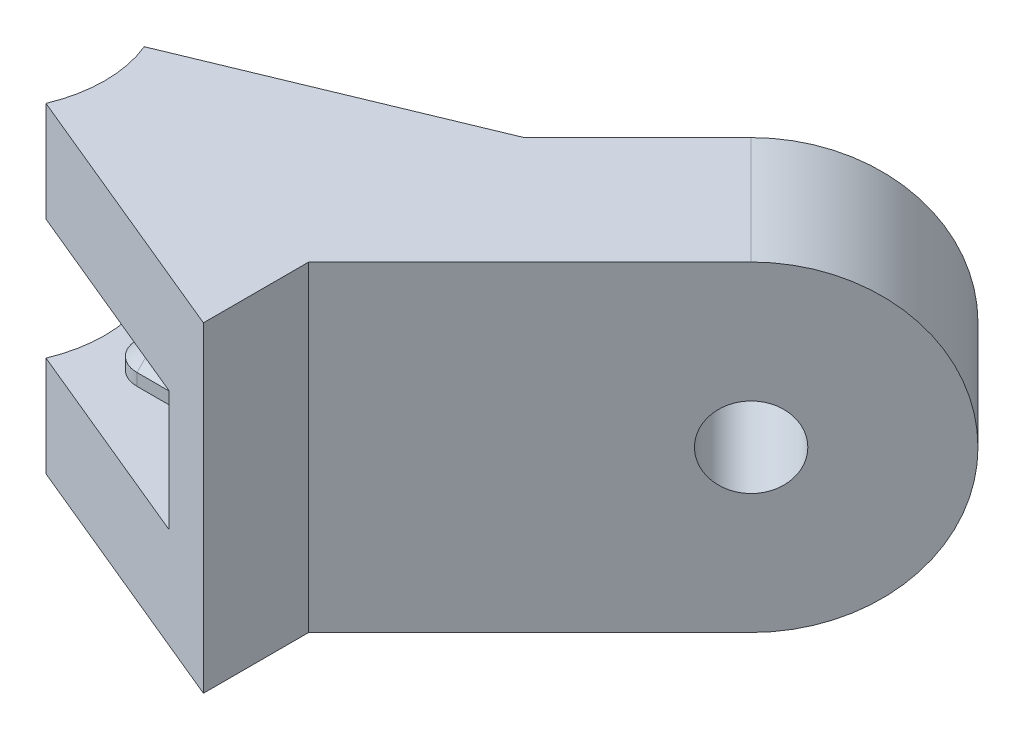
ISO-10303-21;
HEADER;
FILE_DESCRIPTION(('STEP AP214'),'2;1');
FILE_NAME('part.step','',(''),(''),'','','');
FILE_SCHEMA(('AUTOMOTIVE_DESIGN { 1 0 10303 214 1 1 1 1 }'));
ENDSEC;
DATA;
#1=APPLICATION_CONTEXT('core data for automotive mechanical design processes');
#2=APPLICATION_PROTOCOL_DEFINITION('international standard','automotive_design',2000,#1);
#3=PRODUCT_CONTEXT('',#1,'mechanical');
#4=PRODUCT('Part','Part','',(#3));
#5=PRODUCT_RELATED_PRODUCT_CATEGORY('part','',(#4));
#6=PRODUCT_DEFINITION_FORMATION('','',#4);
#7=PRODUCT_DEFINITION_CONTEXT('part definition',#1,'design');
#8=PRODUCT_DEFINITION('design','',#6,#7);
#9=PRODUCT_DEFINITION_SHAPE('','',#8);
#10=(LENGTH_UNIT() NAMED_UNIT(*) SI_UNIT(.MILLI.,.METRE.));
#11=(NAMED_UNIT(*) PLANE_ANGLE_UNIT() SI_UNIT($,.RADIAN.));
#12=(NAMED_UNIT(*) SI_UNIT($,.STERADIAN.) SOLID_ANGLE_UNIT());
#13=UNCERTAINTY_MEASURE_WITH_UNIT(LENGTH_MEASURE(1.E-05),#10,'distance_accuracy_value','');
#14=(GEOMETRIC_REPRESENTATION_CONTEXT(3) GLOBAL_UNCERTAINTY_ASSIGNED_CONTEXT((#13)) GLOBAL_UNIT_ASSIGNED_CONTEXT((#10,
#11,#12)) REPRESENTATION_CONTEXT('',''));
#15=CARTESIAN_POINT('',(0.,0.,0.));
#16=DIRECTION('',(0.,0.,1.));
#17=DIRECTION('',(1.,0.,0.));
#18=AXIS2_PLACEMENT_3D('',#15,#16,#17);
#19=CARTESIAN_POINT('',(9.65685424949246,4.,-4.));
#20=DIRECTION('',(-1.,0.,0.));
#21=DIRECTION('',(0.,0.,1.));
#22=AXIS2_PLACEMENT_3D('',#19,#20,#21);
#23=PLANE('',#22);
#24=DIRECTION('',(0.,-1.,0.));
#25=VECTOR('',#24,1.);
#26=CARTESIAN_POINT('',(9.65685424949246,17.8311243216161,1.37401153701777));
#27=LINE('',#26,#25);
#28=CARTESIAN_POINT('',(9.65685424949246,4.,1.37401153701777));
#29=VERTEX_POINT('',#28);
#30=CARTESIAN_POINT('',(9.65685424949246,-4.,1.37401153701777));
#31=VERTEX_POINT('',#30);
#32=EDGE_CURVE('E206',#29,#31,#27,.T.);
#33=ORIENTED_EDGE('',*,*,#32,.F.);
#34=DIRECTION('',(0.,0.,-1.));
#35=VECTOR('',#34,1.);
#36=CARTESIAN_POINT('',(9.65685424949246,4.,-4.));
#37=LINE('',#36,#35);
#38=CARTESIAN_POINT('',(9.65685424949246,4.,4.));
#39=VERTEX_POINT('',#38);
#40=EDGE_CURVE('E289',#39,#29,#37,.T.);
#41=ORIENTED_EDGE('',*,*,#40,.F.);
#42=DIRECTION('',(0.,-1.,0.));
#43=VECTOR('',#42,1.);
#44=CARTESIAN_POINT('',(9.65685424949246,4.,4.));
#45=LINE('',#44,#43);
#46=CARTESIAN_POINT('',(9.65685424949246,-4.,4.));
#47=VERTEX_POINT('',#46);
#48=EDGE_CURVE('E214',#39,#47,#45,.T.);
#49=ORIENTED_EDGE('',*,*,#48,.T.);
#50=DIRECTION('',(0.,0.,-1.));
#51=VECTOR('',#50,1.);
#52=CARTESIAN_POINT('',(9.65685424949246,-4.,-4.));
#53=LINE('',#52,#51);
#54=EDGE_CURVE('E201',#47,#31,#53,.T.);
#55=ORIENTED_EDGE('',*,*,#54,.T.);
#56=EDGE_LOOP('',(#33,#41,#49,#55));
#57=FACE_BOUND('',#56,.T.);
#58=ADVANCED_FACE('F33',(#57),#23,.F.);
#59=CARTESIAN_POINT('',(0.,1.5,-4.));
#60=DIRECTION('',(0.,1.,0.));
#61=DIRECTION('',(-1.,0.,0.));
#62=AXIS2_PLACEMENT_3D('',#59,#60,#61);
#63=PLANE('',#62);
#64=DIRECTION('',(0.,0.,1.));
#65=VECTOR('',#64,1.);
#66=CARTESIAN_POINT('',(8.2,1.50000000000001,-4.));
#67=LINE('',#66,#65);
#68=CARTESIAN_POINT('',(8.2,1.50000000000001,-3.39655121145935));
#69=VERTEX_POINT('',#68);
#70=CARTESIAN_POINT('',(8.2,1.50000000000001,3.39655121145935));
#71=VERTEX_POINT('',#70);
#72=EDGE_CURVE('E270',#69,#71,#67,.T.);
#73=ORIENTED_EDGE('',*,*,#72,.T.);
#74=DIRECTION('',(0.923879532511288,0.,0.382683432365087));
#75=VECTOR('',#74,1.);
#76=CARTESIAN_POINT('',(9.65685424949246,1.50000000000001,4.));
#77=LINE('',#76,#75);
#78=CARTESIAN_POINT('',(2.95641450403612,1.5,1.22458698356828));
#79=VERTEX_POINT('',#78);
#80=EDGE_CURVE('E322',#79,#71,#77,.T.);
#81=ORIENTED_EDGE('',*,*,#80,.F.);
#82=CARTESIAN_POINT('',(0.,1.5,0.));
#83=DIRECTION('',(0.,1.,0.));
#84=DIRECTION('',(-1.,0.,0.));
#85=AXIS2_PLACEMENT_3D('',#82,#83,#84);
#86=CIRCLE('',#85,3.2);
#87=CARTESIAN_POINT('',(2.95641450403612,1.5,-1.22458698356828));
#88=VERTEX_POINT('',#87);
#89=EDGE_CURVE('E284',#88,#79,#86,.F.);
#90=ORIENTED_EDGE('',*,*,#89,.F.);
#91=DIRECTION('',(-0.923879532511288,0.,0.382683432365087));
#92=VECTOR('',#91,1.);
#93=CARTESIAN_POINT('',(2.95641450403612,1.5,-1.22458698356828));
#94=LINE('',#93,#92);
#95=EDGE_CURVE('E216',#69,#88,#94,.T.);
#96=ORIENTED_EDGE('',*,*,#95,.F.);
#97=EDGE_LOOP('',(#73,#81,#90,#96));
#98=FACE_BOUND('',#97,.T.);
#99=CARTESIAN_POINT('',(4.7,1.5,0.));
#100=DIRECTION('',(0.,-1.,0.));
#101=DIRECTION('',(0.,0.,-1.));
#102=AXIS2_PLACEMENT_3D('',#99,#100,#101);
#103=CIRCLE('',#102,0.7);
#104=CARTESIAN_POINT('',(4.7,1.5,0.7));
#105=VERTEX_POINT('',#104);
#106=CARTESIAN_POINT('',(4.7,1.5,-0.7));
#107=VERTEX_POINT('',#106);
#108=EDGE_CURVE('E248',#105,#107,#103,.T.);
#109=ORIENTED_EDGE('',*,*,#108,.F.);
#110=DIRECTION('',(-1.,0.,0.));
#111=VECTOR('',#110,1.);
#112=CARTESIAN_POINT('',(4.7,1.5,0.7));
#113=LINE('',#112,#111);
#114=CARTESIAN_POINT('',(5.5,1.5,0.7));
#115=VERTEX_POINT('',#114);
#116=EDGE_CURVE('E258',#115,#105,#113,.T.);
#117=ORIENTED_EDGE('',*,*,#116,.F.);
#118=CARTESIAN_POINT('',(5.5,1.5,0.));
#119=DIRECTION('',(0.,-1.,0.));
#120=DIRECTION('',(0.,0.,-1.));
#121=AXIS2_PLACEMENT_3D('',#118,#119,#120);
#122=CIRCLE('',#121,0.7);
#123=CARTESIAN_POINT('',(5.5,1.5,-0.7));
#124=VERTEX_POINT('',#123);
#125=EDGE_CURVE('E255',#124,#115,#122,.T.);
#126=ORIENTED_EDGE('',*,*,#125,.F.);
#127=DIRECTION('',(1.,0.,0.));
#128=VECTOR('',#127,1.);
#129=CARTESIAN_POINT('',(4.7,1.5,-0.7));
#130=LINE('',#129,#128);
#131=EDGE_CURVE('E251',#107,#124,#130,.T.);
#132=ORIENTED_EDGE('',*,*,#131,.F.);
#133=EDGE_LOOP('',(#109,#117,#126,#132));
#134=FACE_BOUND('',#133,.T.);
#135=ADVANCED_FACE('F427',(#98,#134),#63,.F.);
#136=CARTESIAN_POINT('',(0.,4.,0.));
#137=DIRECTION('',(0.,-1.,0.));
#138=DIRECTION('',(0.,0.,-1.));
#139=AXIS2_PLACEMENT_3D('',#136,#137,#138);
#140=CYLINDRICAL_SURFACE('',#139,3.2);
#141=DIRECTION('',(0.,-1.,0.));
#142=VECTOR('',#141,1.);
#143=CARTESIAN_POINT('',(2.95641450403612,4.,-1.22458698356828));
#144=LINE('',#143,#142);
#145=CARTESIAN_POINT('',(2.95641450403612,4.,-1.22458698356828));
#146=VERTEX_POINT('',#145);
#147=EDGE_CURVE('E310',#146,#88,#144,.T.);
#148=ORIENTED_EDGE('',*,*,#147,.T.);
#149=ORIENTED_EDGE('',*,*,#89,.T.);
#150=DIRECTION('',(0.,-1.,0.));
#151=VECTOR('',#150,1.);
#152=CARTESIAN_POINT('',(2.95641450403612,4.,1.22458698356828));
#153=LINE('',#152,#151);
#154=CARTESIAN_POINT('',(2.95641450403612,4.,1.22458698356828));
#155=VERTEX_POINT('',#154);
#156=EDGE_CURVE('E306',#155,#79,#153,.T.);
#157=ORIENTED_EDGE('',*,*,#156,.F.);
#158=CARTESIAN_POINT('',(0.,4.,0.));
#159=DIRECTION('',(0.,-1.,0.));
#160=DIRECTION('',(0.,0.,1.));
#161=AXIS2_PLACEMENT_3D('',#158,#159,#160);
#162=CIRCLE('',#161,3.2);
#163=EDGE_CURVE('E294',#146,#155,#162,.T.);
#164=ORIENTED_EDGE('',*,*,#163,.F.);
#165=EDGE_LOOP('',(#148,#149,#157,#164));
#166=FACE_BOUND('',#165,.T.);
#167=ADVANCED_FACE('F413',(#166),#140,.F.);
#168=CARTESIAN_POINT('',(2.95641450403612,4.,-1.22458698356828));
#169=DIRECTION('',(0.382683432365087,0.,0.923879532511288));
#170=DIRECTION('',(0.923879532511288,0.,-0.382683432365087));
#171=AXIS2_PLACEMENT_3D('',#168,#169,#170);
#172=PLANE('',#171);
#173=DIRECTION('',(0.,1.,0.));
#174=VECTOR('',#173,1.);
#175=CARTESIAN_POINT('',(8.2,4.,-3.39655121145935));
#176=LINE('',#175,#174);
#177=CARTESIAN_POINT('',(8.2,-1.5,-3.39655121145935));
#178=VERTEX_POINT('',#177);
#179=EDGE_CURVE('E281',#178,#69,#176,.T.);
#180=ORIENTED_EDGE('',*,*,#179,.T.);
#181=ORIENTED_EDGE('',*,*,#95,.T.);
#182=ORIENTED_EDGE('',*,*,#147,.F.);
#183=DIRECTION('',(-0.923879532511288,0.,0.382683432365087));
#184=VECTOR('',#183,1.);
#185=CARTESIAN_POINT('',(2.95641450403612,4.,-1.22458698356828));
#186=LINE('',#185,#184);
#187=CARTESIAN_POINT('',(9.65685424949246,4.,-4.));
#188=VERTEX_POINT('',#187);
#189=EDGE_CURVE('E291',#188,#146,#186,.T.);
#190=ORIENTED_EDGE('',*,*,#189,.F.);
#191=DIRECTION('',(0.,-1.,0.));
#192=VECTOR('',#191,1.);
#193=CARTESIAN_POINT('',(9.65685424949246,4.,-4.));
#194=LINE('',#193,#192);
#195=CARTESIAN_POINT('',(9.65685424949246,-4.,-4.));
#196=VERTEX_POINT('',#195);
#197=EDGE_CURVE('E313',#188,#196,#194,.T.);
#198=ORIENTED_EDGE('',*,*,#197,.T.);
#199=DIRECTION('',(-0.923879532511288,0.,0.382683432365087));
#200=VECTOR('',#199,1.);
#201=CARTESIAN_POINT('',(2.95641450403612,-4.,-1.22458698356828));
#202=LINE('',#201,#200);
#203=CARTESIAN_POINT('',(2.95641450403612,-4.,-1.22458698356828));
#204=VERTEX_POINT('',#203);
#205=EDGE_CURVE('E215',#196,#204,#202,.T.);
#206=ORIENTED_EDGE('',*,*,#205,.T.);
#207=CARTESIAN_POINT('',(2.95641450403612,-1.5,-1.22458698356828));
#208=VERTEX_POINT('',#207);
#209=EDGE_CURVE('E309',#208,#204,#144,.T.);
#210=ORIENTED_EDGE('',*,*,#209,.F.);
#211=DIRECTION('',(0.923879532511288,0.,-0.382683432365087));
#212=VECTOR('',#211,1.);
#213=CARTESIAN_POINT('',(2.95641450403612,-1.5,-1.22458698356828));
#214=LINE('',#213,#212);
#215=EDGE_CURVE('E278',#208,#178,#214,.T.);
#216=ORIENTED_EDGE('',*,*,#215,.T.);
#217=EDGE_LOOP('',(#180,#181,#182,#190,#198,#206,#210,#216));
#218=FACE_BOUND('',#217,.T.);
#219=ADVANCED_FACE('F408',(#218),#172,.F.);
#220=CARTESIAN_POINT('',(2.95641450403612,-1.5,1.22458698356828));
#221=VERTEX_POINT('',#220);
#222=CARTESIAN_POINT('',(2.95641450403612,-4.,1.22458698356828));
#223=VERTEX_POINT('',#222);
#224=EDGE_CURVE('E305',#221,#223,#153,.T.);
#225=ORIENTED_EDGE('',*,*,#224,.F.);
#226=CARTESIAN_POINT('',(0.,-1.5,0.));
#227=DIRECTION('',(0.,-1.,0.));
#228=DIRECTION('',(0.,0.,-1.));
#229=AXIS2_PLACEMENT_3D('',#226,#227,#228);
#230=CIRCLE('',#229,3.2);
#231=EDGE_CURVE('E273',#221,#208,#230,.F.);
#232=ORIENTED_EDGE('',*,*,#231,.T.);
#233=ORIENTED_EDGE('',*,*,#209,.T.);
#234=CARTESIAN_POINT('',(0.,-4.,0.));
#235=DIRECTION('',(0.,-1.,0.));
#236=DIRECTION('',(0.,0.,1.));
#237=AXIS2_PLACEMENT_3D('',#234,#235,#236);
#238=CIRCLE('',#237,3.2);
#239=EDGE_CURVE('E300',#204,#223,#238,.T.);
#240=ORIENTED_EDGE('',*,*,#239,.T.);
#241=EDGE_LOOP('',(#225,#232,#233,#240));
#242=FACE_BOUND('',#241,.T.);
#243=ADVANCED_FACE('F419',(#242),#140,.F.);
#244=CARTESIAN_POINT('',(9.65685424949246,4.,4.));
#245=DIRECTION('',(0.382683432365087,0.,-0.923879532511288));
#246=DIRECTION('',(-0.923879532511288,0.,-0.382683432365087));
#247=AXIS2_PLACEMENT_3D('',#244,#245,#246);
#248=PLANE('',#247);
#249=ORIENTED_EDGE('',*,*,#156,.T.);
#250=ORIENTED_EDGE('',*,*,#80,.T.);
#251=DIRECTION('',(0.,-1.,0.));
#252=VECTOR('',#251,1.);
#253=CARTESIAN_POINT('',(8.2,4.,3.39655121145935));
#254=LINE('',#253,#252);
#255=CARTESIAN_POINT('',(8.2,-1.5,3.39655121145935));
#256=VERTEX_POINT('',#255);
#257=EDGE_CURVE('E319',#71,#256,#254,.T.);
#258=ORIENTED_EDGE('',*,*,#257,.T.);
#259=DIRECTION('',(-0.923879532511288,0.,-0.382683432365087));
#260=VECTOR('',#259,1.);
#261=CARTESIAN_POINT('',(9.65685424949246,-1.5,4.));
#262=LINE('',#261,#260);
#263=EDGE_CURVE('E316',#256,#221,#262,.T.);
#264=ORIENTED_EDGE('',*,*,#263,.T.);
#265=ORIENTED_EDGE('',*,*,#224,.T.);
#266=DIRECTION('',(0.923879532511288,0.,0.382683432365087));
#267=VECTOR('',#266,1.);
#268=CARTESIAN_POINT('',(9.65685424949246,-4.,4.));
#269=LINE('',#268,#267);
#270=EDGE_CURVE('E292',#223,#47,#269,.T.);
#271=ORIENTED_EDGE('',*,*,#270,.T.);
#272=ORIENTED_EDGE('',*,*,#48,.F.);
#273=DIRECTION('',(0.923879532511288,0.,0.382683432365087));
#274=VECTOR('',#273,1.);
#275=CARTESIAN_POINT('',(9.65685424949246,4.,4.));
#276=LINE('',#275,#274);
#277=EDGE_CURVE('E296',#155,#39,#276,.T.);
#278=ORIENTED_EDGE('',*,*,#277,.F.);
#279=EDGE_LOOP('',(#249,#250,#258,#264,#265,#271,#272,#278));
#280=FACE_BOUND('',#279,.T.);
#281=ADVANCED_FACE('F416',(#280),#248,.F.);
#282=CARTESIAN_POINT('',(0.,4.,0.));
#283=DIRECTION('',(0.,1.,0.));
#284=DIRECTION('',(0.,0.,1.));
#285=AXIS2_PLACEMENT_3D('',#282,#283,#284);
#286=PLANE('',#285);
#287=DIRECTION('',(0.707106781186546,0.,-0.707106781186549));
#288=VECTOR('',#287,1.);
#289=CARTESIAN_POINT('',(18.0007142674937,4.,-6.96984848098351));
#290=LINE('',#289,#288);
#291=CARTESIAN_POINT('',(15.1722871427475,4.,-4.14142135623732));
#292=VERTEX_POINT('',#291);
#293=EDGE_CURVE('E220',#29,#292,#290,.T.);
#294=ORIENTED_EDGE('',*,*,#293,.T.);
#295=DIRECTION('',(-0.707106781186548,0.,-0.707106781186547));
#296=VECTOR('',#295,1.);
#297=CARTESIAN_POINT('',(12.4852813742386,4.,-6.8284271247462));
#298=LINE('',#297,#296);
#299=CARTESIAN_POINT('',(12.4852813742386,4.,-6.8284271247462));
#300=VERTEX_POINT('',#299);
#301=EDGE_CURVE('E11',#292,#300,#298,.T.);
#302=ORIENTED_EDGE('',*,*,#301,.T.);
#303=DIRECTION('',(-0.707106781186546,0.,0.707106781186549));
#304=VECTOR('',#303,1.);
#305=CARTESIAN_POINT('',(9.65685424949246,4.,-4.));
#306=LINE('',#305,#304);
#307=EDGE_CURVE('E221',#300,#188,#306,.T.);
#308=ORIENTED_EDGE('',*,*,#307,.T.);
#309=ORIENTED_EDGE('',*,*,#189,.T.);
#310=ORIENTED_EDGE('',*,*,#163,.T.);
#311=ORIENTED_EDGE('',*,*,#277,.T.);
#312=ORIENTED_EDGE('',*,*,#40,.T.);
#313=EDGE_LOOP('',(#294,#302,#308,#309,#310,#311,#312));
#314=FACE_BOUND('',#313,.T.);
#315=ADVANCED_FACE('F397',(#314),#286,.T.);
#316=CARTESIAN_POINT('',(0.,-4.,0.));
#317=DIRECTION('',(0.,1.,0.));
#318=DIRECTION('',(0.,0.,1.));
#319=AXIS2_PLACEMENT_3D('',#316,#317,#318);
#320=PLANE('',#319);
#321=DIRECTION('',(0.707106781186546,0.,-0.707106781186549));
#322=VECTOR('',#321,1.);
#323=CARTESIAN_POINT('',(9.65685424949246,-4.,-4.));
#324=LINE('',#323,#322);
#325=CARTESIAN_POINT('',(12.4852813742386,-4.,-6.8284271247462));
#326=VERTEX_POINT('',#325);
#327=EDGE_CURVE('E207',#196,#326,#324,.T.);
#328=ORIENTED_EDGE('',*,*,#327,.T.);
#329=DIRECTION('',(0.707106781186548,0.,0.707106781186547));
#330=VECTOR('',#329,1.);
#331=CARTESIAN_POINT('',(9.65685424949241,-4.,-9.65685424949242));
#332=LINE('',#331,#330);
#333=CARTESIAN_POINT('',(15.1722871427475,-4.,-4.14142135623732));
#334=VERTEX_POINT('',#333);
#335=EDGE_CURVE('E203',#326,#334,#332,.T.);
#336=ORIENTED_EDGE('',*,*,#335,.T.);
#337=DIRECTION('',(-0.707106781186546,0.,0.707106781186549));
#338=VECTOR('',#337,1.);
#339=CARTESIAN_POINT('',(18.0007142674937,-4.,-6.96984848098351));
#340=LINE('',#339,#338);
#341=EDGE_CURVE('E196',#334,#31,#340,.T.);
#342=ORIENTED_EDGE('',*,*,#341,.T.);
#343=ORIENTED_EDGE('',*,*,#54,.F.);
#344=ORIENTED_EDGE('',*,*,#270,.F.);
#345=ORIENTED_EDGE('',*,*,#239,.F.);
#346=ORIENTED_EDGE('',*,*,#205,.F.);
#347=EDGE_LOOP('',(#328,#336,#342,#343,#344,#345,#346));
#348=FACE_BOUND('',#347,.T.);
#349=ADVANCED_FACE('F199',(#348),#320,.F.);
#350=CARTESIAN_POINT('',(8.2,1.50000000000001,-4.));
#351=DIRECTION('',(1.,0.,0.));
#352=DIRECTION('',(0.,1.,0.));
#353=AXIS2_PLACEMENT_3D('',#350,#351,#352);
#354=PLANE('',#353);
#355=DIRECTION('',(0.,0.,1.));
#356=VECTOR('',#355,1.);
#357=CARTESIAN_POINT('',(8.2,-1.5,-4.));
#358=LINE('',#357,#356);
#359=EDGE_CURVE('E269',#178,#256,#358,.T.);
#360=ORIENTED_EDGE('',*,*,#359,.T.);
#361=ORIENTED_EDGE('',*,*,#257,.F.);
#362=ORIENTED_EDGE('',*,*,#72,.F.);
#363=ORIENTED_EDGE('',*,*,#179,.F.);
#364=EDGE_LOOP('',(#360,#361,#362,#363));
#365=FACE_BOUND('',#364,.T.);
#366=ADVANCED_FACE('F424',(#365),#354,.F.);
#367=CARTESIAN_POINT('',(0.,-1.5,-4.));
#368=DIRECTION('',(0.,-1.,0.));
#369=DIRECTION('',(0.,0.,-1.));
#370=AXIS2_PLACEMENT_3D('',#367,#368,#369);
#371=PLANE('',#370);
#372=DIRECTION('',(-1.,0.,0.));
#373=VECTOR('',#372,1.);
#374=CARTESIAN_POINT('',(4.7,-1.5,0.7));
#375=LINE('',#374,#373);
#376=CARTESIAN_POINT('',(5.5,-1.5,0.7));
#377=VERTEX_POINT('',#376);
#378=CARTESIAN_POINT('',(4.7,-1.5,0.7));
#379=VERTEX_POINT('',#378);
#380=EDGE_CURVE('E229',#377,#379,#375,.T.);
#381=ORIENTED_EDGE('',*,*,#380,.T.);
#382=CARTESIAN_POINT('',(4.7,-1.5,0.));
#383=DIRECTION('',(0.,-1.,0.));
#384=DIRECTION('',(0.,0.,-1.));
#385=AXIS2_PLACEMENT_3D('',#382,#383,#384);
#386=CIRCLE('',#385,0.7);
#387=CARTESIAN_POINT('',(4.7,-1.5,-0.7));
#388=VERTEX_POINT('',#387);
#389=EDGE_CURVE('E226',#379,#388,#386,.T.);
#390=ORIENTED_EDGE('',*,*,#389,.T.);
#391=DIRECTION('',(1.,0.,0.));
#392=VECTOR('',#391,1.);
#393=CARTESIAN_POINT('',(4.7,-1.5,-0.7));
#394=LINE('',#393,#392);
#395=CARTESIAN_POINT('',(5.5,-1.5,-0.7));
#396=VERTEX_POINT('',#395);
#397=EDGE_CURVE('E236',#388,#396,#394,.T.);
#398=ORIENTED_EDGE('',*,*,#397,.T.);
#399=CARTESIAN_POINT('',(5.5,-1.5,0.));
#400=DIRECTION('',(0.,-1.,0.));
#401=DIRECTION('',(0.,0.,-1.));
#402=AXIS2_PLACEMENT_3D('',#399,#400,#401);
#403=CIRCLE('',#402,0.7);
#404=EDGE_CURVE('E233',#396,#377,#403,.T.);
#405=ORIENTED_EDGE('',*,*,#404,.T.);
#406=EDGE_LOOP('',(#381,#390,#398,#405));
#407=FACE_BOUND('',#406,.T.);
#408=ORIENTED_EDGE('',*,*,#231,.F.);
#409=ORIENTED_EDGE('',*,*,#263,.F.);
#410=ORIENTED_EDGE('',*,*,#359,.F.);
#411=ORIENTED_EDGE('',*,*,#215,.F.);
#412=EDGE_LOOP('',(#408,#409,#410,#411));
#413=FACE_BOUND('',#412,.T.);
#414=ADVANCED_FACE('F422',(#407,#413),#371,.F.);
#415=CARTESIAN_POINT('',(4.7,0.9,0.));
#416=DIRECTION('',(0.,1.,0.));
#417=DIRECTION('',(0.,0.,1.));
#418=AXIS2_PLACEMENT_3D('',#415,#416,#417);
#419=CYLINDRICAL_SURFACE('',#418,0.7);
#420=DIRECTION('',(0.,1.,0.));
#421=VECTOR('',#420,1.);
#422=CARTESIAN_POINT('',(4.7,0.9,-0.7));
#423=LINE('',#422,#421);
#424=CARTESIAN_POINT('',(4.7,1.2,-0.7));
#425=VERTEX_POINT('',#424);
#426=EDGE_CURVE('E267',#425,#107,#423,.T.);
#427=ORIENTED_EDGE('',*,*,#426,.F.);
#428=CARTESIAN_POINT('',(4.7,1.2,0.));
#429=DIRECTION('',(0.,-1.,0.));
#430=DIRECTION('',(0.,0.,-1.));
#431=AXIS2_PLACEMENT_3D('',#428,#429,#430);
#432=CIRCLE('',#431,0.7);
#433=CARTESIAN_POINT('',(4.7,1.2,0.7));
#434=VERTEX_POINT('',#433);
#435=EDGE_CURVE('E339',#425,#434,#432,.F.);
#436=ORIENTED_EDGE('',*,*,#435,.T.);
#437=DIRECTION('',(0.,1.,0.));
#438=VECTOR('',#437,1.);
#439=CARTESIAN_POINT('',(4.7,0.9,0.7));
#440=LINE('',#439,#438);
#441=EDGE_CURVE('E261',#434,#105,#440,.T.);
#442=ORIENTED_EDGE('',*,*,#441,.T.);
#443=ORIENTED_EDGE('',*,*,#108,.T.);
#444=EDGE_LOOP('',(#427,#436,#442,#443));
#445=FACE_BOUND('',#444,.T.);
#446=ADVANCED_FACE('F463',(#445),#419,.T.);
#447=CARTESIAN_POINT('',(4.7,0.9,-0.7));
#448=DIRECTION('',(0.,0.,1.));
#449=DIRECTION('',(1.,0.,0.));
#450=AXIS2_PLACEMENT_3D('',#447,#448,#449);
#451=PLANE('',#450);
#452=DIRECTION('',(0.,1.,0.));
#453=VECTOR('',#452,1.);
#454=CARTESIAN_POINT('',(5.5,0.9,-0.7));
#455=LINE('',#454,#453);
#456=CARTESIAN_POINT('',(5.5,1.2,-0.7));
#457=VERTEX_POINT('',#456);
#458=EDGE_CURVE('E265',#457,#124,#455,.T.);
#459=ORIENTED_EDGE('',*,*,#458,.F.);
#460=DIRECTION('',(-1.,0.,0.));
#461=VECTOR('',#460,1.);
#462=CARTESIAN_POINT('',(4.7,1.2,-0.7));
#463=LINE('',#462,#461);
#464=EDGE_CURVE('E334',#457,#425,#463,.T.);
#465=ORIENTED_EDGE('',*,*,#464,.T.);
#466=ORIENTED_EDGE('',*,*,#426,.T.);
#467=ORIENTED_EDGE('',*,*,#131,.T.);
#468=EDGE_LOOP('',(#459,#465,#466,#467));
#469=FACE_BOUND('',#468,.T.);
#470=ADVANCED_FACE('F462',(#469),#451,.F.);
#471=CARTESIAN_POINT('',(5.5,0.9,0.));
#472=DIRECTION('',(0.,1.,0.));
#473=DIRECTION('',(0.,0.,1.));
#474=AXIS2_PLACEMENT_3D('',#471,#472,#473);
#475=CYLINDRICAL_SURFACE('',#474,0.7);
#476=DIRECTION('',(0.,1.,0.));
#477=VECTOR('',#476,1.);
#478=CARTESIAN_POINT('',(5.5,0.9,0.7));
#479=LINE('',#478,#477);
#480=CARTESIAN_POINT('',(5.5,1.2,0.7));
#481=VERTEX_POINT('',#480);
#482=EDGE_CURVE('E263',#481,#115,#479,.T.);
#483=ORIENTED_EDGE('',*,*,#482,.F.);
#484=CARTESIAN_POINT('',(5.5,1.2,0.));
#485=DIRECTION('',(0.,-1.,0.));
#486=DIRECTION('',(0.,0.,-1.));
#487=AXIS2_PLACEMENT_3D('',#484,#485,#486);
#488=CIRCLE('',#487,0.7);
#489=EDGE_CURVE('E337',#481,#457,#488,.F.);
#490=ORIENTED_EDGE('',*,*,#489,.T.);
#491=ORIENTED_EDGE('',*,*,#458,.T.);
#492=ORIENTED_EDGE('',*,*,#125,.T.);
#493=EDGE_LOOP('',(#483,#490,#491,#492));
#494=FACE_BOUND('',#493,.T.);
#495=ADVANCED_FACE('F444',(#494),#475,.T.);
#496=CARTESIAN_POINT('',(4.7,0.9,0.7));
#497=DIRECTION('',(0.,0.,-1.));
#498=DIRECTION('',(-1.,0.,0.));
#499=AXIS2_PLACEMENT_3D('',#496,#497,#498);
#500=PLANE('',#499);
#501=ORIENTED_EDGE('',*,*,#441,.F.);
#502=DIRECTION('',(1.,0.,0.));
#503=VECTOR('',#502,1.);
#504=CARTESIAN_POINT('',(5.5,1.2,0.7));
#505=LINE('',#504,#503);
#506=EDGE_CURVE('E341',#434,#481,#505,.T.);
#507=ORIENTED_EDGE('',*,*,#506,.T.);
#508=ORIENTED_EDGE('',*,*,#482,.T.);
#509=ORIENTED_EDGE('',*,*,#116,.T.);
#510=EDGE_LOOP('',(#501,#507,#508,#509));
#511=FACE_BOUND('',#510,.T.);
#512=ADVANCED_FACE('F439',(#511),#500,.F.);
#513=CARTESIAN_POINT('',(4.7,0.9,0.));
#514=DIRECTION('',(0.,-1.,0.));
#515=DIRECTION('',(0.,0.,-1.));
#516=AXIS2_PLACEMENT_3D('',#513,#514,#515);
#517=PLANE('',#516);
#518=CARTESIAN_POINT('',(4.7,0.9,0.));
#519=DIRECTION('',(0.,-1.,0.));
#520=DIRECTION('',(0.,0.,-1.));
#521=AXIS2_PLACEMENT_3D('',#518,#519,#520);
#522=CIRCLE('',#521,0.400000000000002);
#523=CARTESIAN_POINT('',(4.7,0.9,0.400000000000002));
#524=VERTEX_POINT('',#523);
#525=CARTESIAN_POINT('',(4.7,0.9,-0.400000000000002));
#526=VERTEX_POINT('',#525);
#527=EDGE_CURVE('E327',#524,#526,#522,.T.);
#528=ORIENTED_EDGE('',*,*,#527,.T.);
#529=DIRECTION('',(1.,0.,0.));
#530=VECTOR('',#529,1.);
#531=CARTESIAN_POINT('',(5.5,0.9,-0.400000000000002));
#532=LINE('',#531,#530);
#533=CARTESIAN_POINT('',(5.5,0.9,-0.400000000000002));
#534=VERTEX_POINT('',#533);
#535=EDGE_CURVE('E331',#526,#534,#532,.T.);
#536=ORIENTED_EDGE('',*,*,#535,.T.);
#537=CARTESIAN_POINT('',(5.5,0.9,0.));
#538=DIRECTION('',(0.,-1.,0.));
#539=DIRECTION('',(0.,0.,-1.));
#540=AXIS2_PLACEMENT_3D('',#537,#538,#539);
#541=CIRCLE('',#540,0.400000000000002);
#542=CARTESIAN_POINT('',(5.5,0.9,0.400000000000002));
#543=VERTEX_POINT('',#542);
#544=EDGE_CURVE('E329',#534,#543,#541,.T.);
#545=ORIENTED_EDGE('',*,*,#544,.T.);
#546=DIRECTION('',(-1.,0.,0.));
#547=VECTOR('',#546,1.);
#548=CARTESIAN_POINT('',(4.7,0.9,0.400000000000002));
#549=LINE('',#548,#547);
#550=EDGE_CURVE('E325',#543,#524,#549,.T.);
#551=ORIENTED_EDGE('',*,*,#550,.T.);
#552=EDGE_LOOP('',(#528,#536,#545,#551));
#553=FACE_BOUND('',#552,.T.);
#554=ADVANCED_FACE('F468',(#553),#517,.T.);
#555=CARTESIAN_POINT('',(4.7,0.9,0.400000000000002));
#556=DIRECTION('',(0.,-0.707106781186545,0.70710678118655));
#557=DIRECTION('',(1.,0.,0.));
#558=AXIS2_PLACEMENT_3D('',#555,#556,#557);
#559=PLANE('',#558);
#560=DIRECTION('',(0.,-0.70710678118655,-0.707106781186545));
#561=VECTOR('',#560,1.);
#562=CARTESIAN_POINT('',(5.5,1.2,0.7));
#563=LINE('',#562,#561);
#564=EDGE_CURVE('E347',#481,#543,#563,.T.);
#565=ORIENTED_EDGE('',*,*,#564,.F.);
#566=ORIENTED_EDGE('',*,*,#506,.F.);
#567=DIRECTION('',(0.,0.70710678118655,0.707106781186545));
#568=VECTOR('',#567,1.);
#569=CARTESIAN_POINT('',(4.7,0.9,0.400000000000002));
#570=LINE('',#569,#568);
#571=EDGE_CURVE('E252',#524,#434,#570,.T.);
#572=ORIENTED_EDGE('',*,*,#571,.F.);
#573=ORIENTED_EDGE('',*,*,#550,.F.);
#574=EDGE_LOOP('',(#565,#566,#572,#573));
#575=FACE_BOUND('',#574,.T.);
#576=ADVANCED_FACE('F449',(#575),#559,.T.);
#577=CARTESIAN_POINT('',(4.7,0.9,0.));
#578=DIRECTION('',(0.,1.,0.));
#579=DIRECTION('',(0.,0.,1.));
#580=AXIS2_PLACEMENT_3D('',#577,#578,#579);
#581=CONICAL_SURFACE('',#580,0.400000000000002,0.785398163397445);
#582=ORIENTED_EDGE('',*,*,#571,.T.);
#583=ORIENTED_EDGE('',*,*,#435,.F.);
#584=DIRECTION('',(0.,0.70710678118655,-0.707106781186545));
#585=VECTOR('',#584,1.);
#586=CARTESIAN_POINT('',(4.7,0.9,-0.400000000000002));
#587=LINE('',#586,#585);
#588=EDGE_CURVE('E345',#526,#425,#587,.T.);
#589=ORIENTED_EDGE('',*,*,#588,.F.);
#590=ORIENTED_EDGE('',*,*,#527,.F.);
#591=EDGE_LOOP('',(#582,#583,#589,#590));
#592=FACE_BOUND('',#591,.T.);
#593=ADVANCED_FACE('F465',(#592),#581,.T.);
#594=CARTESIAN_POINT('',(5.5,0.9,0.));
#595=DIRECTION('',(0.,1.,0.));
#596=DIRECTION('',(0.,0.,1.));
#597=AXIS2_PLACEMENT_3D('',#594,#595,#596);
#598=CONICAL_SURFACE('',#597,0.400000000000002,0.785398163397445);
#599=ORIENTED_EDGE('',*,*,#564,.T.);
#600=ORIENTED_EDGE('',*,*,#544,.F.);
#601=DIRECTION('',(0.,-0.70710678118655,0.707106781186545));
#602=VECTOR('',#601,1.);
#603=CARTESIAN_POINT('',(5.5,1.2,-0.7));
#604=LINE('',#603,#602);
#605=EDGE_CURVE('E247',#457,#534,#604,.T.);
#606=ORIENTED_EDGE('',*,*,#605,.F.);
#607=ORIENTED_EDGE('',*,*,#489,.F.);
#608=EDGE_LOOP('',(#599,#600,#606,#607));
#609=FACE_BOUND('',#608,.T.);
#610=ADVANCED_FACE('F454',(#609),#598,.T.);
#611=CARTESIAN_POINT('',(4.7,0.9,-0.400000000000002));
#612=DIRECTION('',(0.,-0.707106781186545,-0.70710678118655));
#613=DIRECTION('',(-1.,0.,0.));
#614=AXIS2_PLACEMENT_3D('',#611,#612,#613);
#615=PLANE('',#614);
#616=ORIENTED_EDGE('',*,*,#588,.T.);
#617=ORIENTED_EDGE('',*,*,#464,.F.);
#618=ORIENTED_EDGE('',*,*,#605,.T.);
#619=ORIENTED_EDGE('',*,*,#535,.F.);
#620=EDGE_LOOP('',(#616,#617,#618,#619));
#621=FACE_BOUND('',#620,.T.);
#622=ADVANCED_FACE('F458',(#621),#615,.T.);
#623=CARTESIAN_POINT('',(4.7,-0.9,0.));
#624=DIRECTION('',(0.,-1.,0.));
#625=DIRECTION('',(0.,0.,-1.));
#626=AXIS2_PLACEMENT_3D('',#623,#624,#625);
#627=CYLINDRICAL_SURFACE('',#626,0.7);
#628=DIRECTION('',(0.,-1.,0.));
#629=VECTOR('',#628,1.);
#630=CARTESIAN_POINT('',(4.7,-0.9,0.7));
#631=LINE('',#630,#629);
#632=CARTESIAN_POINT('',(4.7,-1.2,0.7));
#633=VERTEX_POINT('',#632);
#634=EDGE_CURVE('E245',#633,#379,#631,.T.);
#635=ORIENTED_EDGE('',*,*,#634,.F.);
#636=CARTESIAN_POINT('',(4.7,-1.2,0.));
#637=DIRECTION('',(0.,1.,0.));
#638=DIRECTION('',(0.,0.,1.));
#639=AXIS2_PLACEMENT_3D('',#636,#637,#638);
#640=CIRCLE('',#639,0.7);
#641=CARTESIAN_POINT('',(4.7,-1.2,-0.7));
#642=VERTEX_POINT('',#641);
#643=EDGE_CURVE('E365',#633,#642,#640,.F.);
#644=ORIENTED_EDGE('',*,*,#643,.T.);
#645=DIRECTION('',(0.,-1.,0.));
#646=VECTOR('',#645,1.);
#647=CARTESIAN_POINT('',(4.7,-0.9,-0.7));
#648=LINE('',#647,#646);
#649=EDGE_CURVE('E239',#642,#388,#648,.T.);
#650=ORIENTED_EDGE('',*,*,#649,.T.);
#651=ORIENTED_EDGE('',*,*,#389,.F.);
#652=EDGE_LOOP('',(#635,#644,#650,#651));
#653=FACE_BOUND('',#652,.T.);
#654=ADVANCED_FACE('F487',(#653),#627,.T.);
#655=CARTESIAN_POINT('',(4.7,-0.9,0.7));
#656=DIRECTION('',(0.,0.,1.));
#657=DIRECTION('',(1.,0.,0.));
#658=AXIS2_PLACEMENT_3D('',#655,#656,#657);
#659=PLANE('',#658);
#660=DIRECTION('',(0.,-1.,0.));
#661=VECTOR('',#660,1.);
#662=CARTESIAN_POINT('',(5.5,-0.9,0.7));
#663=LINE('',#662,#661);
#664=CARTESIAN_POINT('',(5.5,-1.2,0.7));
#665=VERTEX_POINT('',#664);
#666=EDGE_CURVE('E243',#665,#377,#663,.T.);
#667=ORIENTED_EDGE('',*,*,#666,.F.);
#668=DIRECTION('',(-1.,0.,0.));
#669=VECTOR('',#668,1.);
#670=CARTESIAN_POINT('',(4.7,-1.2,0.7));
#671=LINE('',#670,#669);
#672=EDGE_CURVE('E367',#665,#633,#671,.T.);
#673=ORIENTED_EDGE('',*,*,#672,.T.);
#674=ORIENTED_EDGE('',*,*,#634,.T.);
#675=ORIENTED_EDGE('',*,*,#380,.F.);
#676=EDGE_LOOP('',(#667,#673,#674,#675));
#677=FACE_BOUND('',#676,.T.);
#678=ADVANCED_FACE('F535',(#677),#659,.T.);
#679=CARTESIAN_POINT('',(5.5,-0.9,0.));
#680=DIRECTION('',(0.,-1.,0.));
#681=DIRECTION('',(0.,0.,-1.));
#682=AXIS2_PLACEMENT_3D('',#679,#680,#681);
#683=CYLINDRICAL_SURFACE('',#682,0.7);
#684=DIRECTION('',(0.,-1.,0.));
#685=VECTOR('',#684,1.);
#686=CARTESIAN_POINT('',(5.5,-0.9,-0.7));
#687=LINE('',#686,#685);
#688=CARTESIAN_POINT('',(5.5,-1.2,-0.7));
#689=VERTEX_POINT('',#688);
#690=EDGE_CURVE('E241',#689,#396,#687,.T.);
#691=ORIENTED_EDGE('',*,*,#690,.F.);
#692=CARTESIAN_POINT('',(5.5,-1.2,0.));
#693=DIRECTION('',(0.,1.,0.));
#694=DIRECTION('',(0.,0.,1.));
#695=AXIS2_PLACEMENT_3D('',#692,#693,#694);
#696=CIRCLE('',#695,0.7);
#697=EDGE_CURVE('E363',#689,#665,#696,.F.);
#698=ORIENTED_EDGE('',*,*,#697,.T.);
#699=ORIENTED_EDGE('',*,*,#666,.T.);
#700=ORIENTED_EDGE('',*,*,#404,.F.);
#701=EDGE_LOOP('',(#691,#698,#699,#700));
#702=FACE_BOUND('',#701,.T.);
#703=ADVANCED_FACE('F531',(#702),#683,.T.);
#704=CARTESIAN_POINT('',(4.7,-0.9,-0.7));
#705=DIRECTION('',(0.,0.,-1.));
#706=DIRECTION('',(-1.,0.,0.));
#707=AXIS2_PLACEMENT_3D('',#704,#705,#706);
#708=PLANE('',#707);
#709=ORIENTED_EDGE('',*,*,#649,.F.);
#710=DIRECTION('',(1.,0.,0.));
#711=VECTOR('',#710,1.);
#712=CARTESIAN_POINT('',(4.7,-1.2,-0.7));
#713=LINE('',#712,#711);
#714=EDGE_CURVE('E343',#642,#689,#713,.T.);
#715=ORIENTED_EDGE('',*,*,#714,.T.);
#716=ORIENTED_EDGE('',*,*,#690,.T.);
#717=ORIENTED_EDGE('',*,*,#397,.F.);
#718=EDGE_LOOP('',(#709,#715,#716,#717));
#719=FACE_BOUND('',#718,.T.);
#720=ADVANCED_FACE('F527',(#719),#708,.T.);
#721=CARTESIAN_POINT('',(4.7,-0.9,0.));
#722=DIRECTION('',(0.,1.,0.));
#723=DIRECTION('',(0.,0.,-1.));
#724=AXIS2_PLACEMENT_3D('',#721,#722,#723);
#725=PLANE('',#724);
#726=CARTESIAN_POINT('',(5.5,-0.9,0.));
#727=DIRECTION('',(0.,1.,0.));
#728=DIRECTION('',(0.,0.,1.));
#729=AXIS2_PLACEMENT_3D('',#726,#727,#728);
#730=CIRCLE('',#729,0.400000000000002);
#731=CARTESIAN_POINT('',(5.5,-0.9,0.400000000000002));
#732=VERTEX_POINT('',#731);
#733=CARTESIAN_POINT('',(5.5,-0.9,-0.400000000000002));
#734=VERTEX_POINT('',#733);
#735=EDGE_CURVE('E358',#732,#734,#730,.T.);
#736=ORIENTED_EDGE('',*,*,#735,.T.);
#737=DIRECTION('',(-1.,0.,0.));
#738=VECTOR('',#737,1.);
#739=CARTESIAN_POINT('',(4.7,-0.9,-0.400000000000002));
#740=LINE('',#739,#738);
#741=CARTESIAN_POINT('',(4.7,-0.9,-0.400000000000002));
#742=VERTEX_POINT('',#741);
#743=EDGE_CURVE('E360',#734,#742,#740,.T.);
#744=ORIENTED_EDGE('',*,*,#743,.T.);
#745=CARTESIAN_POINT('',(4.7,-0.9,0.));
#746=DIRECTION('',(0.,1.,0.));
#747=DIRECTION('',(0.,0.,1.));
#748=AXIS2_PLACEMENT_3D('',#745,#746,#747);
#749=CIRCLE('',#748,0.400000000000002);
#750=CARTESIAN_POINT('',(4.7,-0.9,0.400000000000002));
#751=VERTEX_POINT('',#750);
#752=EDGE_CURVE('E356',#742,#751,#749,.T.);
#753=ORIENTED_EDGE('',*,*,#752,.T.);
#754=DIRECTION('',(1.,0.,0.));
#755=VECTOR('',#754,1.);
#756=CARTESIAN_POINT('',(4.7,-0.9,0.400000000000002));
#757=LINE('',#756,#755);
#758=EDGE_CURVE('E354',#751,#732,#757,.T.);
#759=ORIENTED_EDGE('',*,*,#758,.T.);
#760=EDGE_LOOP('',(#736,#744,#753,#759));
#761=FACE_BOUND('',#760,.T.);
#762=ADVANCED_FACE('F506',(#761),#725,.T.);
#763=CARTESIAN_POINT('',(4.7,-1.2,0.7));
#764=DIRECTION('',(0.,-0.707106781186545,-0.70710678118655));
#765=DIRECTION('',(-1.,0.,0.));
#766=AXIS2_PLACEMENT_3D('',#763,#764,#765);
#767=PLANE('',#766);
#768=DIRECTION('',(0.,-0.70710678118655,0.707106781186545));
#769=VECTOR('',#768,1.);
#770=CARTESIAN_POINT('',(5.5,-0.9,0.400000000000002));
#771=LINE('',#770,#769);
#772=EDGE_CURVE('E373',#732,#665,#771,.T.);
#773=ORIENTED_EDGE('',*,*,#772,.F.);
#774=ORIENTED_EDGE('',*,*,#758,.F.);
#775=DIRECTION('',(0.,0.70710678118655,-0.707106781186545));
#776=VECTOR('',#775,1.);
#777=CARTESIAN_POINT('',(4.7,-1.2,0.7));
#778=LINE('',#777,#776);
#779=EDGE_CURVE('E230',#633,#751,#778,.T.);
#780=ORIENTED_EDGE('',*,*,#779,.F.);
#781=ORIENTED_EDGE('',*,*,#672,.F.);
#782=EDGE_LOOP('',(#773,#774,#780,#781));
#783=FACE_BOUND('',#782,.T.);
#784=ADVANCED_FACE('F503',(#783),#767,.F.);
#785=CARTESIAN_POINT('',(4.7,-1.2,0.));
#786=DIRECTION('',(0.,-1.,0.));
#787=DIRECTION('',(0.,0.,-1.));
#788=AXIS2_PLACEMENT_3D('',#785,#786,#787);
#789=CONICAL_SURFACE('',#788,0.7,0.785398163397445);
#790=ORIENTED_EDGE('',*,*,#779,.T.);
#791=ORIENTED_EDGE('',*,*,#752,.F.);
#792=DIRECTION('',(0.,0.70710678118655,0.707106781186545));
#793=VECTOR('',#792,1.);
#794=CARTESIAN_POINT('',(4.7,-1.2,-0.7));
#795=LINE('',#794,#793);
#796=EDGE_CURVE('E371',#642,#742,#795,.T.);
#797=ORIENTED_EDGE('',*,*,#796,.F.);
#798=ORIENTED_EDGE('',*,*,#643,.F.);
#799=EDGE_LOOP('',(#790,#791,#797,#798));
#800=FACE_BOUND('',#799,.T.);
#801=ADVANCED_FACE('F499',(#800),#789,.T.);
#802=CARTESIAN_POINT('',(5.5,-1.2,0.));
#803=DIRECTION('',(0.,-1.,0.));
#804=DIRECTION('',(0.,0.,-1.));
#805=AXIS2_PLACEMENT_3D('',#802,#803,#804);
#806=CONICAL_SURFACE('',#805,0.7,0.785398163397445);
#807=ORIENTED_EDGE('',*,*,#772,.T.);
#808=ORIENTED_EDGE('',*,*,#697,.F.);
#809=DIRECTION('',(0.,-0.70710678118655,-0.707106781186545));
#810=VECTOR('',#809,1.);
#811=CARTESIAN_POINT('',(5.5,-0.9,-0.400000000000002));
#812=LINE('',#811,#810);
#813=EDGE_CURVE('E369',#734,#689,#812,.T.);
#814=ORIENTED_EDGE('',*,*,#813,.F.);
#815=ORIENTED_EDGE('',*,*,#735,.F.);
#816=EDGE_LOOP('',(#807,#808,#814,#815));
#817=FACE_BOUND('',#816,.T.);
#818=ADVANCED_FACE('F495',(#817),#806,.T.);
#819=CARTESIAN_POINT('',(4.7,-1.2,-0.7));
#820=DIRECTION('',(0.,-0.707106781186545,0.70710678118655));
#821=DIRECTION('',(1.,0.,0.));
#822=AXIS2_PLACEMENT_3D('',#819,#820,#821);
#823=PLANE('',#822);
#824=ORIENTED_EDGE('',*,*,#796,.T.);
#825=ORIENTED_EDGE('',*,*,#743,.F.);
#826=ORIENTED_EDGE('',*,*,#813,.T.);
#827=ORIENTED_EDGE('',*,*,#714,.F.);
#828=EDGE_LOOP('',(#824,#825,#826,#827));
#829=FACE_BOUND('',#828,.T.);
#830=ADVANCED_FACE('F492',(#829),#823,.F.);
#831=CARTESIAN_POINT('',(18.0007142674937,17.8311243216161,-6.96984848098351));
#832=DIRECTION('',(-0.707106781186549,0.,-0.707106781186546));
#833=DIRECTION('',(-0.707106781186546,0.,0.707106781186549));
#834=AXIS2_PLACEMENT_3D('',#831,#832,#833);
#835=PLANE('',#834);
#836=CARTESIAN_POINT('',(15.1722871427475,0.,-4.14142135623732));
#837=DIRECTION('',(0.707106781186549,0.,0.707106781186546));
#838=DIRECTION('',(0.707106781186546,0.,-0.707106781186549));
#839=AXIS2_PLACEMENT_3D('',#836,#837,#838);
#840=CIRCLE('',#839,1.);
#841=CARTESIAN_POINT('',(15.8793939239341,0.,-4.84852813742387));
#842=VERTEX_POINT('',#841);
#843=EDGE_CURVE('E390',#842,#842,#840,.T.);
#844=ORIENTED_EDGE('',*,*,#843,.F.);
#845=EDGE_LOOP('',(#844));
#846=FACE_BOUND('',#845,.T.);
#847=ORIENTED_EDGE('',*,*,#341,.F.);
#848=CARTESIAN_POINT('',(15.1722871427475,0.,-4.14142135623732));
#849=DIRECTION('',(-0.707106781186549,0.,-0.707106781186546));
#850=DIRECTION('',(-0.707106781186546,0.,0.707106781186549));
#851=AXIS2_PLACEMENT_3D('',#848,#849,#850);
#852=CIRCLE('',#851,4.);
#853=CARTESIAN_POINT('',(18.0007142674937,0.,-6.96984848098351));
#854=VERTEX_POINT('',#853);
#855=EDGE_CURVE('E381',#334,#854,#852,.F.);
#856=ORIENTED_EDGE('',*,*,#855,.T.);
#857=CARTESIAN_POINT('',(15.1722871427475,0.,-4.14142135623732));
#858=DIRECTION('',(-0.707106781186549,0.,-0.707106781186546));
#859=DIRECTION('',(-0.707106781186546,0.,0.707106781186549));
#860=AXIS2_PLACEMENT_3D('',#857,#858,#859);
#861=CIRCLE('',#860,4.);
#862=EDGE_CURVE('E379',#854,#292,#861,.F.);
#863=ORIENTED_EDGE('',*,*,#862,.T.);
#864=ORIENTED_EDGE('',*,*,#293,.F.);
#865=ORIENTED_EDGE('',*,*,#32,.T.);
#866=EDGE_LOOP('',(#847,#856,#863,#864,#865));
#867=FACE_BOUND('',#866,.T.);
#868=ADVANCED_FACE('F219',(#846,#867),#835,.F.);
#869=CARTESIAN_POINT('',(9.65685424949246,17.8311243216161,-4.));
#870=DIRECTION('',(0.707106781186549,0.,0.707106781186546));
#871=DIRECTION('',(0.707106781186546,0.,-0.707106781186549));
#872=AXIS2_PLACEMENT_3D('',#869,#870,#871);
#873=PLANE('',#872);
#874=CARTESIAN_POINT('',(12.4852813742386,0.,-6.82842712474619));
#875=DIRECTION('',(0.707106781186549,0.,0.707106781186546));
#876=DIRECTION('',(0.707106781186546,0.,-0.707106781186549));
#877=AXIS2_PLACEMENT_3D('',#874,#875,#876);
#878=CIRCLE('',#877,1.);
#879=CARTESIAN_POINT('',(13.1923881554252,0.,-7.53553390593274));
#880=VERTEX_POINT('',#879);
#881=EDGE_CURVE('E37',#880,#880,#878,.T.);
#882=ORIENTED_EDGE('',*,*,#881,.T.);
#883=EDGE_LOOP('',(#882));
#884=FACE_BOUND('',#883,.T.);
#885=CARTESIAN_POINT('',(12.4852813742386,0.,-6.8284271247462));
#886=DIRECTION('',(0.707106781186549,0.,0.707106781186546));
#887=DIRECTION('',(0.707106781186546,0.,-0.707106781186549));
#888=AXIS2_PLACEMENT_3D('',#885,#886,#887);
#889=CIRCLE('',#888,4.);
#890=CARTESIAN_POINT('',(15.3137084989848,0.,-9.65685424949239));
#891=VERTEX_POINT('',#890);
#892=EDGE_CURVE('E50',#300,#891,#889,.F.);
#893=ORIENTED_EDGE('',*,*,#892,.T.);
#894=CARTESIAN_POINT('',(12.4852813742386,0.,-6.8284271247462));
#895=DIRECTION('',(0.707106781186549,0.,0.707106781186546));
#896=DIRECTION('',(0.707106781186546,0.,-0.707106781186549));
#897=AXIS2_PLACEMENT_3D('',#894,#895,#896);
#898=CIRCLE('',#897,4.);
#899=EDGE_CURVE('E42',#891,#326,#898,.F.);
#900=ORIENTED_EDGE('',*,*,#899,.T.);
#901=ORIENTED_EDGE('',*,*,#327,.F.);
#902=ORIENTED_EDGE('',*,*,#197,.F.);
#903=ORIENTED_EDGE('',*,*,#307,.F.);
#904=EDGE_LOOP('',(#893,#900,#901,#902,#903));
#905=FACE_BOUND('',#904,.T.);
#906=ADVANCED_FACE('F402',(#884,#905),#873,.F.);
#907=CARTESIAN_POINT('',(9.65685424949241,0.,-9.65685424949242));
#908=DIRECTION('',(0.707106781186548,0.,0.707106781186547));
#909=DIRECTION('',(0.707106781186547,0.,-0.707106781186548));
#910=AXIS2_PLACEMENT_3D('',#907,#908,#909);
#911=CYLINDRICAL_SURFACE('',#910,4.);
#912=DIRECTION('',(-0.707106781186548,0.,-0.707106781186547));
#913=VECTOR('',#912,1.);
#914=CARTESIAN_POINT('',(18.0007142674937,0.,-6.96984848098351));
#915=LINE('',#914,#913);
#916=EDGE_CURVE('E384',#891,#854,#915,.F.);
#917=ORIENTED_EDGE('',*,*,#916,.F.);
#918=ORIENTED_EDGE('',*,*,#892,.F.);
#919=ORIENTED_EDGE('',*,*,#301,.F.);
#920=ORIENTED_EDGE('',*,*,#862,.F.);
#921=EDGE_LOOP('',(#917,#918,#919,#920));
#922=FACE_BOUND('',#921,.T.);
#923=ADVANCED_FACE('F35',(#922),#911,.T.);
#924=CARTESIAN_POINT('',(9.65685424949241,0.,-9.65685424949242));
#925=DIRECTION('',(0.707106781186548,0.,0.707106781186547));
#926=DIRECTION('',(0.707106781186547,0.,-0.707106781186548));
#927=AXIS2_PLACEMENT_3D('',#924,#925,#926);
#928=CYLINDRICAL_SURFACE('',#927,4.);
#929=ORIENTED_EDGE('',*,*,#899,.F.);
#930=ORIENTED_EDGE('',*,*,#916,.T.);
#931=ORIENTED_EDGE('',*,*,#855,.F.);
#932=ORIENTED_EDGE('',*,*,#335,.F.);
#933=EDGE_LOOP('',(#929,#930,#931,#932));
#934=FACE_BOUND('',#933,.T.);
#935=ADVANCED_FACE('F400',(#934),#928,.T.);
#936=CARTESIAN_POINT('',(6.30663437676426,0.,-13.0070741222205));
#937=DIRECTION('',(0.707106781186549,0.,0.707106781186546));
#938=DIRECTION('',(0.707106781186546,0.,-0.707106781186549));
#939=AXIS2_PLACEMENT_3D('',#936,#937,#938);
#940=CYLINDRICAL_SURFACE('',#939,1.);
#941=CARTESIAN_POINT('',(15.8793939239341,0.,-4.84852813742387));
#942=CARTESIAN_POINT('',(15.8514042805121,0.,-4.87651778084584));
#943=CARTESIAN_POINT('',(15.8234146370901,0.,-4.9045074242678));
#944=CARTESIAN_POINT('',(15.7674353502462,0.,-4.96048671111174));
#945=CARTESIAN_POINT('',(15.7394457068242,0.,-4.98847635453371));
#946=CARTESIAN_POINT('',(15.6834664199803,0.,-5.04445564137764));
#947=CARTESIAN_POINT('',(15.6554767765583,0.,-5.07244528479961));
#948=CARTESIAN_POINT('',(15.5994974897144,0.,-5.12842457164354));
#949=CARTESIAN_POINT('',(15.5715078462924,0.,-5.15641421506551));
#950=CARTESIAN_POINT('',(15.5155285594485,0.,-5.21239350190945));
#951=CARTESIAN_POINT('',(15.4875389160265,0.,-5.24038314533141));
#952=CARTESIAN_POINT('',(15.4315596291826,0.,-5.29636243217535));
#953=CARTESIAN_POINT('',(15.4035699857606,0.,-5.32435207559731));
#954=CARTESIAN_POINT('',(15.3475906989167,0.,-5.38033136244125));
#955=CARTESIAN_POINT('',(15.3196010554947,0.,-5.40832100586322));
#956=CARTESIAN_POINT('',(15.2636217686508,0.,-5.46430029270715));
#957=CARTESIAN_POINT('',(15.2356321252288,0.,-5.49228993612912));
#958=CARTESIAN_POINT('',(15.1796528383849,0.,-5.54826922297305));
#959=CARTESIAN_POINT('',(15.1516631949629,0.,-5.57625886639502));
#960=CARTESIAN_POINT('',(15.095683908119,0.,-5.63223815323896));
#961=CARTESIAN_POINT('',(15.067694264697,0.,-5.66022779666092));
#962=CARTESIAN_POINT('',(15.0117149778531,0.,-5.71620708350486));
#963=CARTESIAN_POINT('',(14.9837253344311,0.,-5.74419672692683));
#964=CARTESIAN_POINT('',(14.9277460475872,0.,-5.80017601377076));
#965=CARTESIAN_POINT('',(14.8997564041652,0.,-5.82816565719273));
#966=CARTESIAN_POINT('',(14.8437771173213,0.,-5.88414494403666));
#967=CARTESIAN_POINT('',(14.8157874738993,0.,-5.91213458745863));
#968=CARTESIAN_POINT('',(14.7598081870554,0.,-5.96811387430257));
#969=CARTESIAN_POINT('',(14.7318185436334,0.,-5.99610351772453));
#970=CARTESIAN_POINT('',(14.6758392567895,0.,-6.05208280456847));
#971=CARTESIAN_POINT('',(14.6478496133675,0.,-6.08007244799044));
#972=CARTESIAN_POINT('',(14.5918703265236,0.,-6.13605173483437));
#973=CARTESIAN_POINT('',(14.5638806831016,0.,-6.16404137825634));
#974=CARTESIAN_POINT('',(14.5079013962577,0.,-6.22002066510027));
#975=CARTESIAN_POINT('',(14.4799117528357,0.,-6.24801030852224));
#976=CARTESIAN_POINT('',(14.4239324659918,0.,-6.30398959536617));
#977=CARTESIAN_POINT('',(14.3959428225698,0.,-6.33197923878814));
#978=CARTESIAN_POINT('',(14.3399635357259,0.,-6.38795852563208));
#979=CARTESIAN_POINT('',(14.3119738923039,0.,-6.41594816905405));
#980=CARTESIAN_POINT('',(14.25599460546,0.,-6.47192745589798));
#981=CARTESIAN_POINT('',(14.228004962038,0.,-6.49991709931995));
#982=CARTESIAN_POINT('',(14.1720256751941,0.,-6.55589638616388));
#983=CARTESIAN_POINT('',(14.1440360317721,0.,-6.58388602958585));
#984=CARTESIAN_POINT('',(14.0880567449282,0.,-6.63986531642978));
#985=CARTESIAN_POINT('',(14.0600671015062,0.,-6.66785495985175));
#986=CARTESIAN_POINT('',(14.0040878146622,0.,-6.72383424669569));
#987=CARTESIAN_POINT('',(13.9760981712403,0.,-6.75182389011766));
#988=CARTESIAN_POINT('',(13.9201188843963,0.,-6.80780317696159));
#989=CARTESIAN_POINT('',(13.8921292409744,0.,-6.83579282038356));
#990=CARTESIAN_POINT('',(13.8361499541304,0.,-6.89177210722749));
#991=CARTESIAN_POINT('',(13.8081603107085,0.,-6.91976175064946));
#992=CARTESIAN_POINT('',(13.7521810238645,0.,-6.97574103749339));
#993=CARTESIAN_POINT('',(13.7241913804426,0.,-7.00373068091536));
#994=CARTESIAN_POINT('',(13.6682120935986,0.,-7.0597099677593));
#995=CARTESIAN_POINT('',(13.6402224501767,0.,-7.08769961118126));
#996=CARTESIAN_POINT('',(13.5842431633327,0.,-7.1436788980252));
#997=CARTESIAN_POINT('',(13.5562535199108,0.,-7.17166854144717));
#998=CARTESIAN_POINT('',(13.5002742330668,0.,-7.2276478282911));
#999=CARTESIAN_POINT('',(13.4722845896449,0.,-7.25563747171307));
#1000=CARTESIAN_POINT('',(13.4163053028009,0.,-7.311616758557));
#1001=CARTESIAN_POINT('',(13.388315659379,0.,-7.33960640197897));
#1002=CARTESIAN_POINT('',(13.332336372535,0.,-7.39558568882291));
#1003=CARTESIAN_POINT('',(13.3043467291131,0.,-7.42357533224487));
#1004=CARTESIAN_POINT('',(13.2483674422691,0.,-7.47955461908881));
#1005=CARTESIAN_POINT('',(13.2203777988472,0.,-7.50754426251078));
#1006=CARTESIAN_POINT('',(13.1923881554252,0.,-7.53553390593274));
#1007=B_SPLINE_CURVE_WITH_KNOTS('',3,(#941,#942,#943,#944,#945,#946,#947,#948,#949,#950,#951,
#952,#953,#954,#955,#956,#957,#958,#959,#960,#961,#962,#963,#964,#965,#966,#967,#968,#969,#970,
#971,#972,#973,#974,#975,#976,#977,#978,#979,#980,#981,#982,#983,#984,#985,#986,#987,#988,#989,
#990,#991,#992,#993,#994,#995,#996,#997,#998,#999,#1000,#1001,#1002,#1003,#1004,#1005,#1006),
.UNSPECIFIED.,.F.,.F.,(4,2,2,2,2,2,2,2,2,2,2,2,2,2,2,2,2,2,2,2,2,2,2,2,2,2,2,2,2,2,2,2,4),(0.,
0.11875,0.237499999999999,0.35625,0.474999999999999,0.593749999999999,0.712499999999998,
0.831249999999998,0.949999999999998,1.06875,1.1875,1.30625,1.425,1.54375,1.6625,1.78125,1.9,
2.01875,2.1375,2.25625,2.375,2.49375,2.6125,2.73125,2.85,2.96875,3.0875,3.20625,3.325,3.44375,
3.5625,3.68125,3.8),.UNSPECIFIED.);
#1008=EDGE_CURVE('BSEAM509',#842,#880,#1007,.T.);
#1009=ORIENTED_EDGE('',*,*,#843,.T.);
#1010=ORIENTED_EDGE('',*,*,#881,.F.);
#1011=ORIENTED_EDGE('',*,*,#1008,.T.);
#1012=ORIENTED_EDGE('',*,*,#1008,.F.);
#1013=EDGE_LOOP('',(#1009,#1011,#1010,#1012));
#1014=FACE_BOUND('',#1013,.T.);
#1015=ADVANCED_FACE('F509',(#1014),#940,.F.);
#1016=CLOSED_SHELL('',(#58,#135,#167,#219,#243,#281,#315,#349,#366,#414,#446,#470,#495,#512,
#554,#576,#593,#610,#622,#654,#678,#703,#720,#762,#784,#801,#818,#830,#868,#906,#923,#935,#1015));
#1017=MANIFOLD_SOLID_BREP('B2',#1016);
#1018=ADVANCED_BREP_SHAPE_REPRESENTATION('',(#18,#1017),#14);
#1019=SHAPE_DEFINITION_REPRESENTATION(#9,#1018);
ENDSEC;
END-ISO-10303-21;
